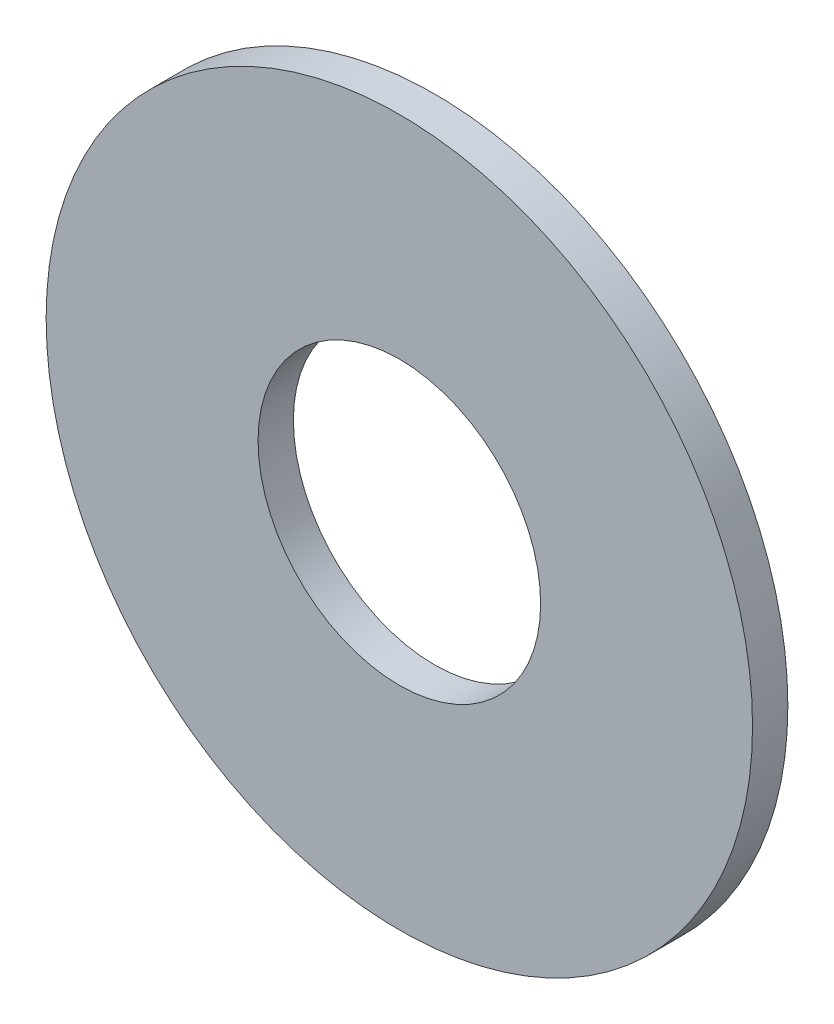
ISO-10303-21;
HEADER;
FILE_DESCRIPTION(('STEP AP214'),'2;1');
FILE_NAME('part.step','',(''),(''),'','','');
FILE_SCHEMA(('AUTOMOTIVE_DESIGN { 1 0 10303 214 1 1 1 1 }'));
ENDSEC;
DATA;
#1=APPLICATION_CONTEXT('core data for automotive mechanical design processes');
#2=APPLICATION_PROTOCOL_DEFINITION('international standard','automotive_design',2000,#1);
#3=PRODUCT_CONTEXT('',#1,'mechanical');
#4=PRODUCT('Part','Part','',(#3));
#5=PRODUCT_RELATED_PRODUCT_CATEGORY('part','',(#4));
#6=PRODUCT_DEFINITION_FORMATION('','',#4);
#7=PRODUCT_DEFINITION_CONTEXT('part definition',#1,'design');
#8=PRODUCT_DEFINITION('design','',#6,#7);
#9=PRODUCT_DEFINITION_SHAPE('','',#8);
#10=(LENGTH_UNIT() NAMED_UNIT(*) SI_UNIT(.MILLI.,.METRE.));
#11=(NAMED_UNIT(*) PLANE_ANGLE_UNIT() SI_UNIT($,.RADIAN.));
#12=(NAMED_UNIT(*) SI_UNIT($,.STERADIAN.) SOLID_ANGLE_UNIT());
#13=UNCERTAINTY_MEASURE_WITH_UNIT(LENGTH_MEASURE(1.E-05),#10,'distance_accuracy_value','');
#14=(GEOMETRIC_REPRESENTATION_CONTEXT(3) GLOBAL_UNCERTAINTY_ASSIGNED_CONTEXT((#13)) GLOBAL_UNIT_ASSIGNED_CONTEXT((#10,
#11,#12)) REPRESENTATION_CONTEXT('',''));
#15=CARTESIAN_POINT('',(0.,0.,0.));
#16=DIRECTION('',(0.,0.,1.));
#17=DIRECTION('',(1.,0.,0.));
#18=AXIS2_PLACEMENT_3D('',#15,#16,#17);
#19=CARTESIAN_POINT('',(0.,0.,1.));
#20=DIRECTION('',(0.,0.,1.));
#21=DIRECTION('',(1.,0.,0.));
#22=AXIS2_PLACEMENT_3D('',#19,#20,#21);
#23=PLANE('',#22);
#24=CARTESIAN_POINT('',(0.,0.,1.));
#25=DIRECTION('',(0.,0.,1.));
#26=DIRECTION('',(1.,0.,0.));
#27=AXIS2_PLACEMENT_3D('',#24,#25,#26);
#28=CIRCLE('',#27,10.);
#29=CARTESIAN_POINT('',(10.,0.,1.));
#30=VERTEX_POINT('',#29);
#31=EDGE_CURVE('E10',#30,#30,#28,.T.);
#32=ORIENTED_EDGE('',*,*,#31,.T.);
#33=EDGE_LOOP('',(#32));
#34=FACE_BOUND('',#33,.T.);
#35=CARTESIAN_POINT('',(0.,0.,1.));
#36=DIRECTION('',(0.,0.,1.));
#37=DIRECTION('',(1.,0.,0.));
#38=AXIS2_PLACEMENT_3D('',#35,#36,#37);
#39=CIRCLE('',#38,4.);
#40=CARTESIAN_POINT('',(4.,0.,1.));
#41=VERTEX_POINT('',#40);
#42=EDGE_CURVE('E44',#41,#41,#39,.T.);
#43=ORIENTED_EDGE('',*,*,#42,.F.);
#44=EDGE_LOOP('',(#43));
#45=FACE_BOUND('',#44,.T.);
#46=ADVANCED_FACE('F33',(#34,#45),#23,.T.);
#47=CARTESIAN_POINT('',(0.,0.,0.));
#48=DIRECTION('',(0.,0.,1.));
#49=DIRECTION('',(1.,0.,0.));
#50=AXIS2_PLACEMENT_3D('',#47,#48,#49);
#51=PLANE('',#50);
#52=CARTESIAN_POINT('',(0.,0.,0.));
#53=DIRECTION('',(0.,0.,1.));
#54=DIRECTION('',(1.,0.,0.));
#55=AXIS2_PLACEMENT_3D('',#52,#53,#54);
#56=CIRCLE('',#55,10.);
#57=CARTESIAN_POINT('',(10.,0.,0.));
#58=VERTEX_POINT('',#57);
#59=EDGE_CURVE('E37',#58,#58,#56,.T.);
#60=ORIENTED_EDGE('',*,*,#59,.F.);
#61=EDGE_LOOP('',(#60));
#62=FACE_BOUND('',#61,.T.);
#63=CARTESIAN_POINT('',(0.,0.,0.));
#64=DIRECTION('',(0.,0.,1.));
#65=DIRECTION('',(1.,0.,0.));
#66=AXIS2_PLACEMENT_3D('',#63,#64,#65);
#67=CIRCLE('',#66,4.);
#68=CARTESIAN_POINT('',(4.,0.,0.));
#69=VERTEX_POINT('',#68);
#70=EDGE_CURVE('E46',#69,#69,#67,.T.);
#71=ORIENTED_EDGE('',*,*,#70,.T.);
#72=EDGE_LOOP('',(#71));
#73=FACE_BOUND('',#72,.T.);
#74=ADVANCED_FACE('F56',(#62,#73),#51,.F.);
#75=CARTESIAN_POINT('',(0.,0.,1.));
#76=DIRECTION('',(0.,0.,-1.));
#77=DIRECTION('',(-1.,0.,0.));
#78=AXIS2_PLACEMENT_3D('',#75,#76,#77);
#79=CYLINDRICAL_SURFACE('',#78,10.);
#80=ORIENTED_EDGE('',*,*,#31,.F.);
#81=EDGE_LOOP('',(#80));
#82=FACE_BOUND('',#81,.T.);
#83=ORIENTED_EDGE('',*,*,#59,.T.);
#84=EDGE_LOOP('',(#83));
#85=FACE_BOUND('',#84,.T.);
#86=ADVANCED_FACE('F35',(#82,#85),#79,.T.);
#87=CARTESIAN_POINT('',(0.,0.,1.));
#88=DIRECTION('',(0.,0.,-1.));
#89=DIRECTION('',(-1.,0.,0.));
#90=AXIS2_PLACEMENT_3D('',#87,#88,#89);
#91=CYLINDRICAL_SURFACE('',#90,4.);
#92=ORIENTED_EDGE('',*,*,#42,.T.);
#93=EDGE_LOOP('',(#92));
#94=FACE_BOUND('',#93,.T.);
#95=ORIENTED_EDGE('',*,*,#70,.F.);
#96=EDGE_LOOP('',(#95));
#97=FACE_BOUND('',#96,.T.);
#98=ADVANCED_FACE('F52',(#94,#97),#91,.F.);
#99=CLOSED_SHELL('',(#46,#74,#86,#98));
#100=MANIFOLD_SOLID_BREP('B2',#99);
#101=ADVANCED_BREP_SHAPE_REPRESENTATION('',(#18,#100),#14);
#102=SHAPE_DEFINITION_REPRESENTATION(#9,#101);
ENDSEC;
END-ISO-10303-21;
